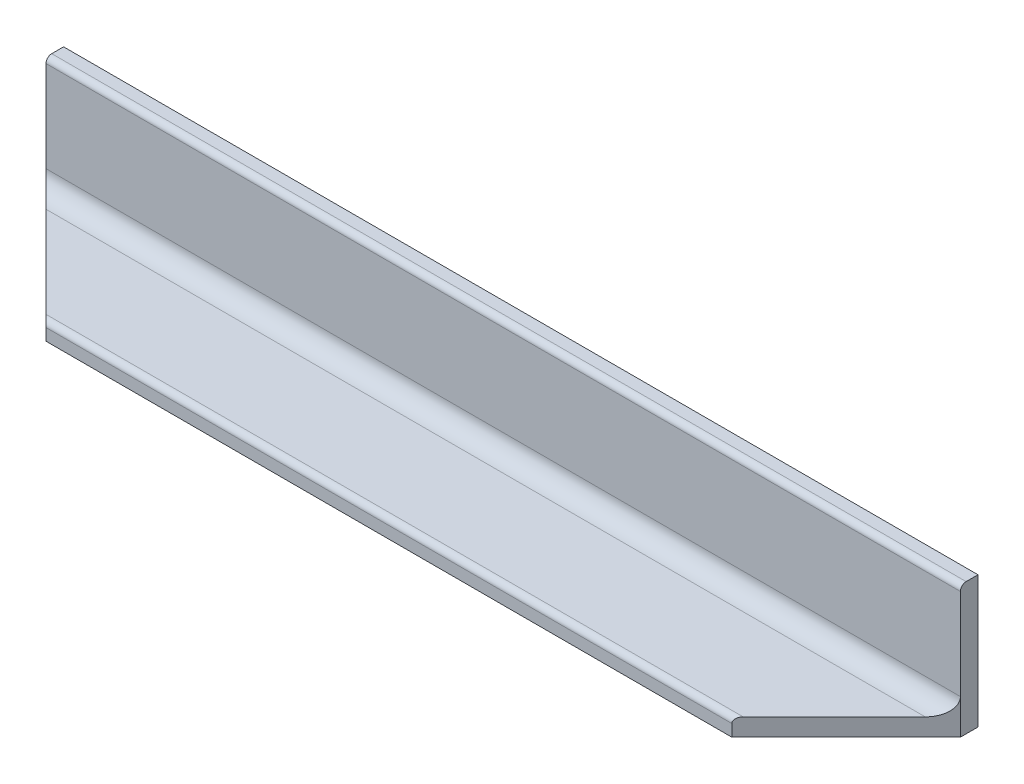
ISO-10303-21;
HEADER;
FILE_DESCRIPTION(('STEP AP214'),'2;1');
FILE_NAME('part.step','',(''),(''),'','','');
FILE_SCHEMA(('AUTOMOTIVE_DESIGN { 1 0 10303 214 1 1 1 1 }'));
ENDSEC;
DATA;
#1=APPLICATION_CONTEXT('core data for automotive mechanical design processes');
#2=APPLICATION_PROTOCOL_DEFINITION('international standard','automotive_design',2000,#1);
#3=PRODUCT_CONTEXT('',#1,'mechanical');
#4=PRODUCT('Part','Part','',(#3));
#5=PRODUCT_RELATED_PRODUCT_CATEGORY('part','',(#4));
#6=PRODUCT_DEFINITION_FORMATION('','',#4);
#7=PRODUCT_DEFINITION_CONTEXT('part definition',#1,'design');
#8=PRODUCT_DEFINITION('design','',#6,#7);
#9=PRODUCT_DEFINITION_SHAPE('','',#8);
#10=(LENGTH_UNIT() NAMED_UNIT(*) SI_UNIT(.MILLI.,.METRE.));
#11=(NAMED_UNIT(*) PLANE_ANGLE_UNIT() SI_UNIT($,.RADIAN.));
#12=(NAMED_UNIT(*) SI_UNIT($,.STERADIAN.) SOLID_ANGLE_UNIT());
#13=UNCERTAINTY_MEASURE_WITH_UNIT(LENGTH_MEASURE(1.E-05),#10,'distance_accuracy_value','');
#14=(GEOMETRIC_REPRESENTATION_CONTEXT(3) GLOBAL_UNCERTAINTY_ASSIGNED_CONTEXT((#13)) GLOBAL_UNIT_ASSIGNED_CONTEXT((#10,
#11,#12)) REPRESENTATION_CONTEXT('',''));
#15=CARTESIAN_POINT('',(0.,0.,0.));
#16=DIRECTION('',(0.,0.,1.));
#17=DIRECTION('',(1.,0.,0.));
#18=AXIS2_PLACEMENT_3D('',#15,#16,#17);
#19=CARTESIAN_POINT('',(104.,0.,30.));
#20=DIRECTION('',(0.,1.,0.));
#21=DIRECTION('',(0.,0.,1.));
#22=AXIS2_PLACEMENT_3D('',#19,#20,#21);
#23=PLANE('',#22);
#24=DIRECTION('',(-1.,0.,0.));
#25=VECTOR('',#24,1.);
#26=CARTESIAN_POINT('',(104.,0.,30.));
#27=LINE('',#26,#25);
#28=CARTESIAN_POINT('',(78.,0.,30.));
#29=VERTEX_POINT('',#28);
#30=CARTESIAN_POINT('',(-78.,0.,30.));
#31=VERTEX_POINT('',#30);
#32=EDGE_CURVE('E137',#29,#31,#27,.T.);
#33=ORIENTED_EDGE('',*,*,#32,.T.);
#34=DIRECTION('',(0.707106781186547,0.,0.707106781186548));
#35=VECTOR('',#34,1.);
#36=CARTESIAN_POINT('',(-104.,0.,4.));
#37=LINE('',#36,#35);
#38=CARTESIAN_POINT('',(-104.,0.,4.));
#39=VERTEX_POINT('',#38);
#40=EDGE_CURVE('E123',#39,#31,#37,.T.);
#41=ORIENTED_EDGE('',*,*,#40,.F.);
#42=DIRECTION('',(0.,0.,-1.));
#43=VECTOR('',#42,1.);
#44=CARTESIAN_POINT('',(-104.,0.,30.));
#45=LINE('',#44,#43);
#46=CARTESIAN_POINT('',(-104.,0.,0.));
#47=VERTEX_POINT('',#46);
#48=EDGE_CURVE('E134',#39,#47,#45,.T.);
#49=ORIENTED_EDGE('',*,*,#48,.T.);
#50=DIRECTION('',(-1.,0.,0.));
#51=VECTOR('',#50,1.);
#52=CARTESIAN_POINT('',(104.,0.,0.));
#53=LINE('',#52,#51);
#54=CARTESIAN_POINT('',(104.,0.,0.));
#55=VERTEX_POINT('',#54);
#56=EDGE_CURVE('E130',#55,#47,#53,.T.);
#57=ORIENTED_EDGE('',*,*,#56,.F.);
#58=DIRECTION('',(0.,0.,-1.));
#59=VECTOR('',#58,1.);
#60=CARTESIAN_POINT('',(104.,0.,30.));
#61=LINE('',#60,#59);
#62=CARTESIAN_POINT('',(104.,0.,4.));
#63=VERTEX_POINT('',#62);
#64=EDGE_CURVE('E94',#63,#55,#61,.T.);
#65=ORIENTED_EDGE('',*,*,#64,.F.);
#66=DIRECTION('',(0.707106781186547,0.,-0.707106781186548));
#67=VECTOR('',#66,1.);
#68=CARTESIAN_POINT('',(104.,0.,4.));
#69=LINE('',#68,#67);
#70=EDGE_CURVE('E54',#29,#63,#69,.T.);
#71=ORIENTED_EDGE('',*,*,#70,.F.);
#72=EDGE_LOOP('',(#33,#41,#49,#57,#65,#71));
#73=FACE_BOUND('',#72,.T.);
#74=ADVANCED_FACE('F40',(#73),#23,.F.);
#75=CARTESIAN_POINT('',(104.,0.,0.));
#76=DIRECTION('',(0.,0.,1.));
#77=DIRECTION('',(0.,-1.,0.));
#78=AXIS2_PLACEMENT_3D('',#75,#76,#77);
#79=PLANE('',#78);
#80=DIRECTION('',(0.,1.,0.));
#81=VECTOR('',#80,1.);
#82=CARTESIAN_POINT('',(-104.,0.,0.));
#83=LINE('',#82,#81);
#84=CARTESIAN_POINT('',(-104.,30.,0.));
#85=VERTEX_POINT('',#84);
#86=EDGE_CURVE('E144',#47,#85,#83,.T.);
#87=ORIENTED_EDGE('',*,*,#86,.T.);
#88=DIRECTION('',(-1.,0.,0.));
#89=VECTOR('',#88,1.);
#90=CARTESIAN_POINT('',(104.,30.,0.));
#91=LINE('',#90,#89);
#92=CARTESIAN_POINT('',(104.,30.,0.));
#93=VERTEX_POINT('',#92);
#94=EDGE_CURVE('E195',#93,#85,#91,.T.);
#95=ORIENTED_EDGE('',*,*,#94,.F.);
#96=DIRECTION('',(0.,1.,0.));
#97=VECTOR('',#96,1.);
#98=CARTESIAN_POINT('',(104.,0.,0.));
#99=LINE('',#98,#97);
#100=EDGE_CURVE('E204',#55,#93,#99,.T.);
#101=ORIENTED_EDGE('',*,*,#100,.F.);
#102=ORIENTED_EDGE('',*,*,#56,.T.);
#103=EDGE_LOOP('',(#87,#95,#101,#102));
#104=FACE_BOUND('',#103,.T.);
#105=ADVANCED_FACE('F202',(#104),#79,.F.);
#106=CARTESIAN_POINT('',(104.,30.,0.));
#107=DIRECTION('',(0.,-1.,0.));
#108=DIRECTION('',(0.,0.,-1.));
#109=AXIS2_PLACEMENT_3D('',#106,#107,#108);
#110=PLANE('',#109);
#111=DIRECTION('',(0.,0.,1.));
#112=VECTOR('',#111,1.);
#113=CARTESIAN_POINT('',(-104.,30.,0.));
#114=LINE('',#113,#112);
#115=CARTESIAN_POINT('',(-104.,30.,2.70000000000001));
#116=VERTEX_POINT('',#115);
#117=EDGE_CURVE('E152',#85,#116,#114,.T.);
#118=ORIENTED_EDGE('',*,*,#117,.T.);
#119=DIRECTION('',(-1.,0.,0.));
#120=VECTOR('',#119,1.);
#121=CARTESIAN_POINT('',(104.,30.,2.70000000000001));
#122=LINE('',#121,#120);
#123=CARTESIAN_POINT('',(104.,30.,2.70000000000001));
#124=VERTEX_POINT('',#123);
#125=EDGE_CURVE('E191',#124,#116,#122,.T.);
#126=ORIENTED_EDGE('',*,*,#125,.F.);
#127=DIRECTION('',(0.,0.,1.));
#128=VECTOR('',#127,1.);
#129=CARTESIAN_POINT('',(104.,30.,0.));
#130=LINE('',#129,#128);
#131=EDGE_CURVE('E209',#93,#124,#130,.T.);
#132=ORIENTED_EDGE('',*,*,#131,.F.);
#133=ORIENTED_EDGE('',*,*,#94,.T.);
#134=EDGE_LOOP('',(#118,#126,#132,#133));
#135=FACE_BOUND('',#134,.T.);
#136=ADVANCED_FACE('F272',(#135),#110,.F.);
#137=CARTESIAN_POINT('',(104.,28.7,2.70000000000001));
#138=DIRECTION('',(-1.,0.,0.));
#139=DIRECTION('',(0.,0.,1.));
#140=AXIS2_PLACEMENT_3D('',#137,#138,#139);
#141=CYLINDRICAL_SURFACE('',#140,1.3);
#142=CARTESIAN_POINT('',(-104.,28.7,2.70000000000001));
#143=DIRECTION('',(1.,0.,0.));
#144=DIRECTION('',(0.,0.,-1.));
#145=AXIS2_PLACEMENT_3D('',#142,#143,#144);
#146=CIRCLE('',#145,1.3);
#147=CARTESIAN_POINT('',(-104.,28.7,4.00000000000001));
#148=VERTEX_POINT('',#147);
#149=EDGE_CURVE('E163',#116,#148,#146,.T.);
#150=ORIENTED_EDGE('',*,*,#149,.T.);
#151=DIRECTION('',(-1.,0.,0.));
#152=VECTOR('',#151,1.);
#153=CARTESIAN_POINT('',(104.,28.7,4.00000000000001));
#154=LINE('',#153,#152);
#155=CARTESIAN_POINT('',(104.,28.7,4.00000000000001));
#156=VERTEX_POINT('',#155);
#157=EDGE_CURVE('E187',#156,#148,#154,.T.);
#158=ORIENTED_EDGE('',*,*,#157,.F.);
#159=CARTESIAN_POINT('',(104.,28.7,2.70000000000001));
#160=DIRECTION('',(1.,0.,0.));
#161=DIRECTION('',(0.,0.,-1.));
#162=AXIS2_PLACEMENT_3D('',#159,#160,#161);
#163=CIRCLE('',#162,1.3);
#164=EDGE_CURVE('E63',#124,#156,#163,.T.);
#165=ORIENTED_EDGE('',*,*,#164,.F.);
#166=ORIENTED_EDGE('',*,*,#125,.T.);
#167=EDGE_LOOP('',(#150,#158,#165,#166));
#168=FACE_BOUND('',#167,.T.);
#169=ADVANCED_FACE('F276',(#168),#141,.T.);
#170=CARTESIAN_POINT('',(104.,28.7,4.00000000000001));
#171=DIRECTION('',(0.,0.,-1.));
#172=DIRECTION('',(0.,1.,0.));
#173=AXIS2_PLACEMENT_3D('',#170,#171,#172);
#174=PLANE('',#173);
#175=DIRECTION('',(0.,-1.,0.));
#176=VECTOR('',#175,1.);
#177=CARTESIAN_POINT('',(-104.,28.7,4.00000000000001));
#178=LINE('',#177,#176);
#179=CARTESIAN_POINT('',(-104.,7.99999999999998,4.));
#180=VERTEX_POINT('',#179);
#181=EDGE_CURVE('E166',#148,#180,#178,.T.);
#182=ORIENTED_EDGE('',*,*,#181,.T.);
#183=DIRECTION('',(-1.,0.,0.));
#184=VECTOR('',#183,1.);
#185=CARTESIAN_POINT('',(104.,7.99999999999998,4.));
#186=LINE('',#185,#184);
#187=CARTESIAN_POINT('',(104.,7.99999999999998,4.));
#188=VERTEX_POINT('',#187);
#189=EDGE_CURVE('E183',#188,#180,#186,.T.);
#190=ORIENTED_EDGE('',*,*,#189,.F.);
#191=DIRECTION('',(0.,-1.,0.));
#192=VECTOR('',#191,1.);
#193=CARTESIAN_POINT('',(104.,28.7,4.00000000000001));
#194=LINE('',#193,#192);
#195=EDGE_CURVE('E158',#156,#188,#194,.T.);
#196=ORIENTED_EDGE('',*,*,#195,.F.);
#197=ORIENTED_EDGE('',*,*,#157,.T.);
#198=EDGE_LOOP('',(#182,#190,#196,#197));
#199=FACE_BOUND('',#198,.T.);
#200=ADVANCED_FACE('F222',(#199),#174,.F.);
#201=CARTESIAN_POINT('',(104.,7.99999999999998,8.));
#202=DIRECTION('',(-1.,0.,0.));
#203=DIRECTION('',(0.,0.,1.));
#204=AXIS2_PLACEMENT_3D('',#201,#202,#203);
#205=CYLINDRICAL_SURFACE('',#204,4.);
#206=ORIENTED_EDGE('',*,*,#189,.T.);
#207=CARTESIAN_POINT('',(-100.,7.99999999999998,8.));
#208=DIRECTION('',(0.707106781186548,0.,-0.707106781186547));
#209=DIRECTION('',(-0.707106781186547,0.,-0.707106781186548));
#210=AXIS2_PLACEMENT_3D('',#207,#208,#209);
#211=ELLIPSE('',#210,5.65685424949238,4.);
#212=CARTESIAN_POINT('',(-100.,3.99999999999998,7.99999999999999));
#213=VERTEX_POINT('',#212);
#214=EDGE_CURVE('E88',#180,#213,#211,.F.);
#215=ORIENTED_EDGE('',*,*,#214,.T.);
#216=DIRECTION('',(-1.,0.,0.));
#217=VECTOR('',#216,1.);
#218=CARTESIAN_POINT('',(104.,3.99999999999998,8.));
#219=LINE('',#218,#217);
#220=CARTESIAN_POINT('',(100.,3.99999999999998,8.));
#221=VERTEX_POINT('',#220);
#222=EDGE_CURVE('E179',#221,#213,#219,.T.);
#223=ORIENTED_EDGE('',*,*,#222,.F.);
#224=CARTESIAN_POINT('',(100.,7.99999999999998,8.));
#225=DIRECTION('',(-0.707106781186548,0.,-0.707106781186547));
#226=DIRECTION('',(-0.707106781186547,0.,0.707106781186548));
#227=AXIS2_PLACEMENT_3D('',#224,#225,#226);
#228=ELLIPSE('',#227,5.65685424949238,4.);
#229=EDGE_CURVE('E147',#221,#188,#228,.F.);
#230=ORIENTED_EDGE('',*,*,#229,.T.);
#231=EDGE_LOOP('',(#206,#215,#223,#230));
#232=FACE_BOUND('',#231,.T.);
#233=ADVANCED_FACE('F224',(#232),#205,.F.);
#234=CARTESIAN_POINT('',(104.,3.99999999999998,8.));
#235=DIRECTION('',(0.,-1.,0.));
#236=DIRECTION('',(0.,0.,-1.));
#237=AXIS2_PLACEMENT_3D('',#234,#235,#236);
#238=PLANE('',#237);
#239=ORIENTED_EDGE('',*,*,#222,.T.);
#240=DIRECTION('',(0.707106781186547,0.,0.707106781186548));
#241=VECTOR('',#240,1.);
#242=CARTESIAN_POINT('',(1.99999999999992,3.99999999999996,110.));
#243=LINE('',#242,#241);
#244=CARTESIAN_POINT('',(-79.3,3.99999999999998,28.7));
#245=VERTEX_POINT('',#244);
#246=EDGE_CURVE('E241',#213,#245,#243,.T.);
#247=ORIENTED_EDGE('',*,*,#246,.T.);
#248=DIRECTION('',(-1.,0.,0.));
#249=VECTOR('',#248,1.);
#250=CARTESIAN_POINT('',(104.,3.99999999999998,28.7));
#251=LINE('',#250,#249);
#252=CARTESIAN_POINT('',(79.3,3.99999999999998,28.7));
#253=VERTEX_POINT('',#252);
#254=EDGE_CURVE('E175',#253,#245,#251,.T.);
#255=ORIENTED_EDGE('',*,*,#254,.F.);
#256=DIRECTION('',(0.707106781186547,0.,-0.707106781186548));
#257=VECTOR('',#256,1.);
#258=CARTESIAN_POINT('',(102.,3.99999999999998,5.99999999999999));
#259=LINE('',#258,#257);
#260=EDGE_CURVE('E155',#253,#221,#259,.T.);
#261=ORIENTED_EDGE('',*,*,#260,.T.);
#262=EDGE_LOOP('',(#239,#247,#255,#261));
#263=FACE_BOUND('',#262,.T.);
#264=ADVANCED_FACE('F231',(#263),#238,.F.);
#265=CARTESIAN_POINT('',(104.,2.69999999999998,28.7));
#266=DIRECTION('',(-1.,0.,0.));
#267=DIRECTION('',(0.,0.,1.));
#268=AXIS2_PLACEMENT_3D('',#265,#266,#267);
#269=CYLINDRICAL_SURFACE('',#268,1.3);
#270=ORIENTED_EDGE('',*,*,#254,.T.);
#271=CARTESIAN_POINT('',(-79.3,2.69999999999998,28.7));
#272=DIRECTION('',(0.707106781186548,0.,-0.707106781186547));
#273=DIRECTION('',(-0.707106781186547,0.,-0.707106781186548));
#274=AXIS2_PLACEMENT_3D('',#271,#272,#273);
#275=ELLIPSE('',#274,1.83847763108502,1.3);
#276=CARTESIAN_POINT('',(-78.,2.69999999999998,30.));
#277=VERTEX_POINT('',#276);
#278=EDGE_CURVE('E244',#245,#277,#275,.T.);
#279=ORIENTED_EDGE('',*,*,#278,.T.);
#280=DIRECTION('',(-1.,0.,0.));
#281=VECTOR('',#280,1.);
#282=CARTESIAN_POINT('',(104.,2.69999999999998,30.));
#283=LINE('',#282,#281);
#284=CARTESIAN_POINT('',(78.,2.69999999999998,30.));
#285=VERTEX_POINT('',#284);
#286=EDGE_CURVE('E171',#285,#277,#283,.T.);
#287=ORIENTED_EDGE('',*,*,#286,.F.);
#288=CARTESIAN_POINT('',(79.3,2.69999999999998,28.7));
#289=DIRECTION('',(-0.707106781186548,0.,-0.707106781186547));
#290=DIRECTION('',(-0.707106781186547,0.,0.707106781186548));
#291=AXIS2_PLACEMENT_3D('',#288,#289,#290);
#292=ELLIPSE('',#291,1.83847763108502,1.3);
#293=EDGE_CURVE('E234',#285,#253,#292,.T.);
#294=ORIENTED_EDGE('',*,*,#293,.T.);
#295=EDGE_LOOP('',(#270,#279,#287,#294));
#296=FACE_BOUND('',#295,.T.);
#297=ADVANCED_FACE('F259',(#296),#269,.T.);
#298=CARTESIAN_POINT('',(104.,2.69999999999997,30.));
#299=DIRECTION('',(0.,0.,-1.));
#300=DIRECTION('',(0.,1.,0.));
#301=AXIS2_PLACEMENT_3D('',#298,#299,#300);
#302=PLANE('',#301);
#303=ORIENTED_EDGE('',*,*,#286,.T.);
#304=DIRECTION('',(0.,-1.,0.));
#305=VECTOR('',#304,1.);
#306=CARTESIAN_POINT('',(-78.,30.,30.));
#307=LINE('',#306,#305);
#308=EDGE_CURVE('E139',#277,#31,#307,.T.);
#309=ORIENTED_EDGE('',*,*,#308,.T.);
#310=ORIENTED_EDGE('',*,*,#32,.F.);
#311=DIRECTION('',(0.,-1.,0.));
#312=VECTOR('',#311,1.);
#313=CARTESIAN_POINT('',(78.,30.,30.));
#314=LINE('',#313,#312);
#315=EDGE_CURVE('E140',#285,#29,#314,.T.);
#316=ORIENTED_EDGE('',*,*,#315,.F.);
#317=EDGE_LOOP('',(#303,#309,#310,#316));
#318=FACE_BOUND('',#317,.T.);
#319=ADVANCED_FACE('F255',(#318),#302,.F.);
#320=CARTESIAN_POINT('',(104.,28.7,2.70000000000001));
#321=DIRECTION('',(1.,0.,0.));
#322=DIRECTION('',(0.,0.,-1.));
#323=AXIS2_PLACEMENT_3D('',#320,#321,#322);
#324=PLANE('',#323);
#325=DIRECTION('',(0.,1.,0.));
#326=VECTOR('',#325,1.);
#327=CARTESIAN_POINT('',(104.,28.7,3.99999999999998));
#328=LINE('',#327,#326);
#329=EDGE_CURVE('E11',#63,#188,#328,.T.);
#330=ORIENTED_EDGE('',*,*,#329,.F.);
#331=ORIENTED_EDGE('',*,*,#64,.T.);
#332=ORIENTED_EDGE('',*,*,#100,.T.);
#333=ORIENTED_EDGE('',*,*,#131,.T.);
#334=ORIENTED_EDGE('',*,*,#164,.T.);
#335=ORIENTED_EDGE('',*,*,#195,.T.);
#336=EDGE_LOOP('',(#330,#331,#332,#333,#334,#335));
#337=FACE_BOUND('',#336,.T.);
#338=ADVANCED_FACE('F220',(#337),#324,.T.);
#339=CARTESIAN_POINT('',(-104.,28.7,2.70000000000001));
#340=DIRECTION('',(1.,0.,0.));
#341=DIRECTION('',(0.,0.,-1.));
#342=AXIS2_PLACEMENT_3D('',#339,#340,#341);
#343=PLANE('',#342);
#344=ORIENTED_EDGE('',*,*,#48,.F.);
#345=DIRECTION('',(0.,1.,0.));
#346=VECTOR('',#345,1.);
#347=CARTESIAN_POINT('',(-104.,28.7,4.));
#348=LINE('',#347,#346);
#349=EDGE_CURVE('E48',#39,#180,#348,.T.);
#350=ORIENTED_EDGE('',*,*,#349,.T.);
#351=ORIENTED_EDGE('',*,*,#181,.F.);
#352=ORIENTED_EDGE('',*,*,#149,.F.);
#353=ORIENTED_EDGE('',*,*,#117,.F.);
#354=ORIENTED_EDGE('',*,*,#86,.F.);
#355=EDGE_LOOP('',(#344,#350,#351,#352,#353,#354));
#356=FACE_BOUND('',#355,.T.);
#357=ADVANCED_FACE('F142',(#356),#343,.F.);
#358=CARTESIAN_POINT('',(-104.,30.,4.));
#359=DIRECTION('',(0.707106781186548,0.,-0.707106781186547));
#360=DIRECTION('',(-0.707106781186547,0.,-0.707106781186548));
#361=AXIS2_PLACEMENT_3D('',#358,#359,#360);
#362=PLANE('',#361);
#363=ORIENTED_EDGE('',*,*,#349,.F.);
#364=ORIENTED_EDGE('',*,*,#40,.T.);
#365=ORIENTED_EDGE('',*,*,#308,.F.);
#366=ORIENTED_EDGE('',*,*,#278,.F.);
#367=ORIENTED_EDGE('',*,*,#246,.F.);
#368=ORIENTED_EDGE('',*,*,#214,.F.);
#369=EDGE_LOOP('',(#363,#364,#365,#366,#367,#368));
#370=FACE_BOUND('',#369,.T.);
#371=ADVANCED_FACE('F122',(#370),#362,.F.);
#372=CARTESIAN_POINT('',(104.,30.,4.));
#373=DIRECTION('',(-0.707106781186548,0.,-0.707106781186547));
#374=DIRECTION('',(-0.707106781186547,0.,0.707106781186548));
#375=AXIS2_PLACEMENT_3D('',#372,#373,#374);
#376=PLANE('',#375);
#377=ORIENTED_EDGE('',*,*,#260,.F.);
#378=ORIENTED_EDGE('',*,*,#293,.F.);
#379=ORIENTED_EDGE('',*,*,#315,.T.);
#380=ORIENTED_EDGE('',*,*,#70,.T.);
#381=ORIENTED_EDGE('',*,*,#329,.T.);
#382=ORIENTED_EDGE('',*,*,#229,.F.);
#383=EDGE_LOOP('',(#377,#378,#379,#380,#381,#382));
#384=FACE_BOUND('',#383,.T.);
#385=ADVANCED_FACE('F227',(#384),#376,.F.);
#386=CLOSED_SHELL('',(#74,#105,#136,#169,#200,#233,#264,#297,#319,#338,#357,#371,#385));
#387=MANIFOLD_SOLID_BREP('B2',#386);
#388=ADVANCED_BREP_SHAPE_REPRESENTATION('',(#18,#387),#14);
#389=SHAPE_DEFINITION_REPRESENTATION(#9,#388);
ENDSEC;
END-ISO-10303-21;
